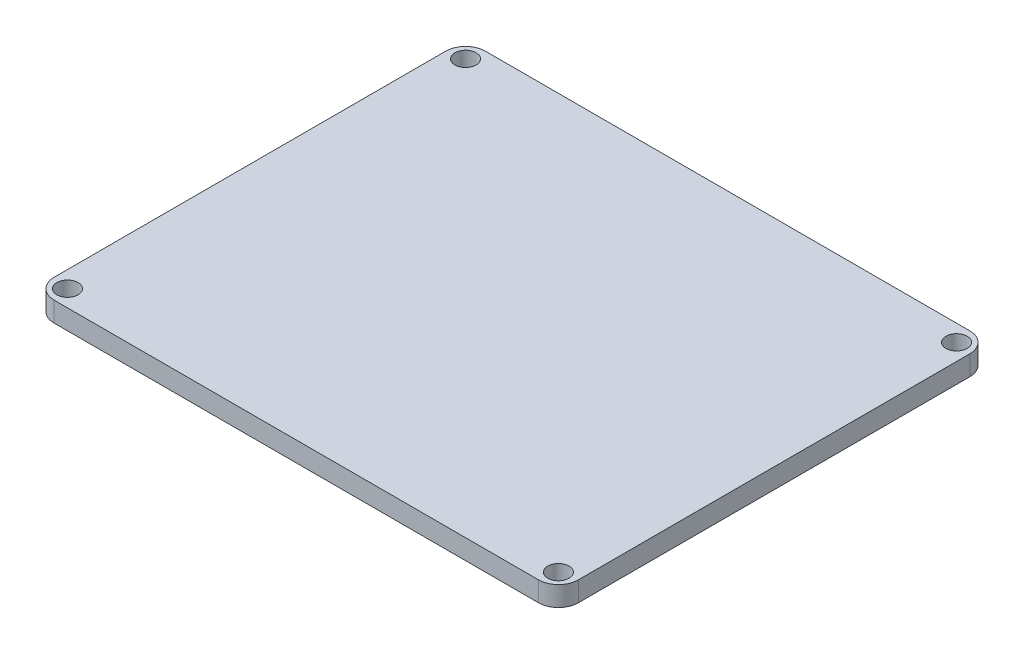
ISO-10303-21;
HEADER;
FILE_DESCRIPTION(('STEP AP214'),'2;1');
FILE_NAME('part.step','',(''),(''),'','','');
FILE_SCHEMA(('AUTOMOTIVE_DESIGN { 1 0 10303 214 1 1 1 1 }'));
ENDSEC;
DATA;
#1=APPLICATION_CONTEXT('core data for automotive mechanical design processes');
#2=APPLICATION_PROTOCOL_DEFINITION('international standard','automotive_design',2000,#1);
#3=PRODUCT_CONTEXT('',#1,'mechanical');
#4=PRODUCT('Part','Part','',(#3));
#5=PRODUCT_RELATED_PRODUCT_CATEGORY('part','',(#4));
#6=PRODUCT_DEFINITION_FORMATION('','',#4);
#7=PRODUCT_DEFINITION_CONTEXT('part definition',#1,'design');
#8=PRODUCT_DEFINITION('design','',#6,#7);
#9=PRODUCT_DEFINITION_SHAPE('','',#8);
#10=(LENGTH_UNIT() NAMED_UNIT(*) SI_UNIT(.MILLI.,.METRE.));
#11=(NAMED_UNIT(*) PLANE_ANGLE_UNIT() SI_UNIT($,.RADIAN.));
#12=(NAMED_UNIT(*) SI_UNIT($,.STERADIAN.) SOLID_ANGLE_UNIT());
#13=UNCERTAINTY_MEASURE_WITH_UNIT(LENGTH_MEASURE(1.E-05),#10,'distance_accuracy_value','');
#14=(GEOMETRIC_REPRESENTATION_CONTEXT(3) GLOBAL_UNCERTAINTY_ASSIGNED_CONTEXT((#13)) GLOBAL_UNIT_ASSIGNED_CONTEXT((#10,
#11,#12)) REPRESENTATION_CONTEXT('',''));
#15=CARTESIAN_POINT('',(0.,0.,0.));
#16=DIRECTION('',(0.,0.,1.));
#17=DIRECTION('',(1.,0.,0.));
#18=AXIS2_PLACEMENT_3D('',#15,#16,#17);
#19=CARTESIAN_POINT('',(0.,3.,0.));
#20=DIRECTION('',(0.,1.,0.));
#21=DIRECTION('',(0.,0.,1.));
#22=AXIS2_PLACEMENT_3D('',#19,#20,#21);
#23=PLANE('',#22);
#24=CARTESIAN_POINT('',(74.,3.,0.));
#25=DIRECTION('',(0.,1.,0.));
#26=DIRECTION('',(0.,0.,1.));
#27=AXIS2_PLACEMENT_3D('',#24,#25,#26);
#28=CIRCLE('',#27,1.60000000000001);
#29=CARTESIAN_POINT('',(74.,3.,1.60000000000001));
#30=VERTEX_POINT('',#29);
#31=EDGE_CURVE('E214',#30,#30,#28,.T.);
#32=ORIENTED_EDGE('',*,*,#31,.F.);
#33=EDGE_LOOP('',(#32));
#34=FACE_BOUND('',#33,.T.);
#35=CARTESIAN_POINT('',(0.,3.,-60.));
#36=DIRECTION('',(0.,1.,0.));
#37=DIRECTION('',(0.,0.,1.));
#38=AXIS2_PLACEMENT_3D('',#35,#36,#37);
#39=CIRCLE('',#38,1.6);
#40=CARTESIAN_POINT('',(0.,3.,-58.4));
#41=VERTEX_POINT('',#40);
#42=EDGE_CURVE('E190',#41,#41,#39,.T.);
#43=ORIENTED_EDGE('',*,*,#42,.F.);
#44=EDGE_LOOP('',(#43));
#45=FACE_BOUND('',#44,.T.);
#46=DIRECTION('',(0.,0.,-1.));
#47=VECTOR('',#46,1.);
#48=CARTESIAN_POINT('',(76.5,3.,2.50000000000001));
#49=LINE('',#48,#47);
#50=CARTESIAN_POINT('',(76.5,3.,-0.499999999999987));
#51=VERTEX_POINT('',#50);
#52=CARTESIAN_POINT('',(76.5,3.,-59.5));
#53=VERTEX_POINT('',#52);
#54=EDGE_CURVE('E200',#51,#53,#49,.T.);
#55=ORIENTED_EDGE('',*,*,#54,.T.);
#56=CARTESIAN_POINT('',(73.5,3.,-59.5));
#57=DIRECTION('',(0.,1.,0.));
#58=DIRECTION('',(0.,0.,1.));
#59=AXIS2_PLACEMENT_3D('',#56,#57,#58);
#60=CIRCLE('',#59,3.);
#61=CARTESIAN_POINT('',(73.5,3.,-62.5));
#62=VERTEX_POINT('',#61);
#63=EDGE_CURVE('E169',#53,#62,#60,.T.);
#64=ORIENTED_EDGE('',*,*,#63,.T.);
#65=DIRECTION('',(-1.,0.,0.));
#66=VECTOR('',#65,1.);
#67=CARTESIAN_POINT('',(76.5,3.,-62.5));
#68=LINE('',#67,#66);
#69=CARTESIAN_POINT('',(0.5,3.,-62.5));
#70=VERTEX_POINT('',#69);
#71=EDGE_CURVE('E127',#62,#70,#68,.T.);
#72=ORIENTED_EDGE('',*,*,#71,.T.);
#73=CARTESIAN_POINT('',(0.499999999999998,3.,-59.5));
#74=DIRECTION('',(0.,1.,0.));
#75=DIRECTION('',(0.,0.,1.));
#76=AXIS2_PLACEMENT_3D('',#73,#74,#75);
#77=CIRCLE('',#76,3.);
#78=CARTESIAN_POINT('',(-2.5,3.,-59.5));
#79=VERTEX_POINT('',#78);
#80=EDGE_CURVE('E161',#70,#79,#77,.T.);
#81=ORIENTED_EDGE('',*,*,#80,.T.);
#82=DIRECTION('',(0.,0.,1.));
#83=VECTOR('',#82,1.);
#84=CARTESIAN_POINT('',(-2.5,3.,2.50000000000002));
#85=LINE('',#84,#83);
#86=CARTESIAN_POINT('',(-2.5,3.,-0.499999999999978));
#87=VERTEX_POINT('',#86);
#88=EDGE_CURVE('E136',#79,#87,#85,.T.);
#89=ORIENTED_EDGE('',*,*,#88,.T.);
#90=CARTESIAN_POINT('',(0.5,3.,-0.499999999999978));
#91=DIRECTION('',(0.,1.,0.));
#92=DIRECTION('',(0.,0.,1.));
#93=AXIS2_PLACEMENT_3D('',#90,#91,#92);
#94=CIRCLE('',#93,3.);
#95=CARTESIAN_POINT('',(0.5,3.,2.50000000000002));
#96=VERTEX_POINT('',#95);
#97=EDGE_CURVE('E62',#87,#96,#94,.T.);
#98=ORIENTED_EDGE('',*,*,#97,.T.);
#99=DIRECTION('',(1.,0.,0.));
#100=VECTOR('',#99,1.);
#101=CARTESIAN_POINT('',(76.5,3.,2.50000000000001));
#102=LINE('',#101,#100);
#103=CARTESIAN_POINT('',(73.5,3.,2.50000000000001));
#104=VERTEX_POINT('',#103);
#105=EDGE_CURVE('E141',#96,#104,#102,.T.);
#106=ORIENTED_EDGE('',*,*,#105,.T.);
#107=CARTESIAN_POINT('',(73.5,3.,-0.499999999999987));
#108=DIRECTION('',(0.,1.,0.));
#109=DIRECTION('',(0.,0.,1.));
#110=AXIS2_PLACEMENT_3D('',#107,#108,#109);
#111=CIRCLE('',#110,3.);
#112=EDGE_CURVE('E166',#104,#51,#111,.T.);
#113=ORIENTED_EDGE('',*,*,#112,.T.);
#114=EDGE_LOOP('',(#55,#64,#72,#81,#89,#98,#106,#113));
#115=FACE_BOUND('',#114,.T.);
#116=CARTESIAN_POINT('',(74.,3.,-60.));
#117=DIRECTION('',(0.,1.,0.));
#118=DIRECTION('',(0.,0.,1.));
#119=AXIS2_PLACEMENT_3D('',#116,#117,#118);
#120=CIRCLE('',#119,1.60000000000001);
#121=CARTESIAN_POINT('',(74.,3.,-58.4));
#122=VERTEX_POINT('',#121);
#123=EDGE_CURVE('E208',#122,#122,#120,.T.);
#124=ORIENTED_EDGE('',*,*,#123,.F.);
#125=EDGE_LOOP('',(#124));
#126=FACE_BOUND('',#125,.T.);
#127=CARTESIAN_POINT('',(0.,3.,0.));
#128=DIRECTION('',(0.,1.,0.));
#129=DIRECTION('',(0.,0.,1.));
#130=AXIS2_PLACEMENT_3D('',#127,#128,#129);
#131=CIRCLE('',#130,1.6);
#132=CARTESIAN_POINT('',(0.,3.,1.6));
#133=VERTEX_POINT('',#132);
#134=EDGE_CURVE('E222',#133,#133,#131,.T.);
#135=ORIENTED_EDGE('',*,*,#134,.F.);
#136=EDGE_LOOP('',(#135));
#137=FACE_BOUND('',#136,.T.);
#138=ADVANCED_FACE('F39',(#34,#45,#115,#126,#137),#23,.T.);
#139=CARTESIAN_POINT('',(0.,0.,0.));
#140=DIRECTION('',(0.,1.,0.));
#141=DIRECTION('',(0.,0.,1.));
#142=AXIS2_PLACEMENT_3D('',#139,#140,#141);
#143=PLANE('',#142);
#144=DIRECTION('',(-1.,0.,0.));
#145=VECTOR('',#144,1.);
#146=CARTESIAN_POINT('',(76.5,0.,-62.5));
#147=LINE('',#146,#145);
#148=CARTESIAN_POINT('',(73.5,0.,-62.5));
#149=VERTEX_POINT('',#148);
#150=CARTESIAN_POINT('',(0.5,0.,-62.5));
#151=VERTEX_POINT('',#150);
#152=EDGE_CURVE('E124',#149,#151,#147,.T.);
#153=ORIENTED_EDGE('',*,*,#152,.F.);
#154=CARTESIAN_POINT('',(73.5,0.,-59.5));
#155=DIRECTION('',(0.,1.,0.));
#156=DIRECTION('',(0.,0.,1.));
#157=AXIS2_PLACEMENT_3D('',#154,#155,#156);
#158=CIRCLE('',#157,3.);
#159=CARTESIAN_POINT('',(76.5,0.,-59.5));
#160=VERTEX_POINT('',#159);
#161=EDGE_CURVE('E106',#149,#160,#158,.F.);
#162=ORIENTED_EDGE('',*,*,#161,.T.);
#163=DIRECTION('',(0.,0.,-1.));
#164=VECTOR('',#163,1.);
#165=CARTESIAN_POINT('',(76.5,0.,2.50000000000001));
#166=LINE('',#165,#164);
#167=CARTESIAN_POINT('',(76.5,0.,-0.499999999999987));
#168=VERTEX_POINT('',#167);
#169=EDGE_CURVE('E137',#168,#160,#166,.T.);
#170=ORIENTED_EDGE('',*,*,#169,.F.);
#171=CARTESIAN_POINT('',(73.5,0.,-0.499999999999987));
#172=DIRECTION('',(0.,1.,0.));
#173=DIRECTION('',(0.,0.,1.));
#174=AXIS2_PLACEMENT_3D('',#171,#172,#173);
#175=CIRCLE('',#174,3.);
#176=CARTESIAN_POINT('',(73.5,0.,2.50000000000001));
#177=VERTEX_POINT('',#176);
#178=EDGE_CURVE('E118',#168,#177,#175,.F.);
#179=ORIENTED_EDGE('',*,*,#178,.T.);
#180=DIRECTION('',(1.,0.,0.));
#181=VECTOR('',#180,1.);
#182=CARTESIAN_POINT('',(76.5,0.,2.50000000000001));
#183=LINE('',#182,#181);
#184=CARTESIAN_POINT('',(0.5,0.,2.50000000000002));
#185=VERTEX_POINT('',#184);
#186=EDGE_CURVE('E143',#185,#177,#183,.T.);
#187=ORIENTED_EDGE('',*,*,#186,.F.);
#188=CARTESIAN_POINT('',(0.5,0.,-0.499999999999978));
#189=DIRECTION('',(0.,1.,0.));
#190=DIRECTION('',(0.,0.,1.));
#191=AXIS2_PLACEMENT_3D('',#188,#189,#190);
#192=CIRCLE('',#191,3.);
#193=CARTESIAN_POINT('',(-2.5,0.,-0.499999999999978));
#194=VERTEX_POINT('',#193);
#195=EDGE_CURVE('E151',#185,#194,#192,.F.);
#196=ORIENTED_EDGE('',*,*,#195,.T.);
#197=DIRECTION('',(0.,0.,1.));
#198=VECTOR('',#197,1.);
#199=CARTESIAN_POINT('',(-2.5,0.,2.50000000000002));
#200=LINE('',#199,#198);
#201=CARTESIAN_POINT('',(-2.5,0.,-59.5));
#202=VERTEX_POINT('',#201);
#203=EDGE_CURVE('E184',#202,#194,#200,.T.);
#204=ORIENTED_EDGE('',*,*,#203,.F.);
#205=CARTESIAN_POINT('',(0.499999999999998,0.,-59.5));
#206=DIRECTION('',(0.,1.,0.));
#207=DIRECTION('',(0.,0.,1.));
#208=AXIS2_PLACEMENT_3D('',#205,#206,#207);
#209=CIRCLE('',#208,3.);
#210=EDGE_CURVE('E129',#202,#151,#209,.F.);
#211=ORIENTED_EDGE('',*,*,#210,.T.);
#212=EDGE_LOOP('',(#153,#162,#170,#179,#187,#196,#204,#211));
#213=FACE_BOUND('',#212,.T.);
#214=CARTESIAN_POINT('',(0.,0.,-60.));
#215=DIRECTION('',(0.,1.,0.));
#216=DIRECTION('',(0.,0.,1.));
#217=AXIS2_PLACEMENT_3D('',#214,#215,#216);
#218=CIRCLE('',#217,1.6);
#219=CARTESIAN_POINT('',(0.,0.,-58.4));
#220=VERTEX_POINT('',#219);
#221=EDGE_CURVE('E195',#220,#220,#218,.T.);
#222=ORIENTED_EDGE('',*,*,#221,.T.);
#223=EDGE_LOOP('',(#222));
#224=FACE_BOUND('',#223,.T.);
#225=CARTESIAN_POINT('',(74.,0.,-60.));
#226=DIRECTION('',(0.,1.,0.));
#227=DIRECTION('',(0.,0.,1.));
#228=AXIS2_PLACEMENT_3D('',#225,#226,#227);
#229=CIRCLE('',#228,1.60000000000001);
#230=CARTESIAN_POINT('',(74.,0.,-58.4));
#231=VERTEX_POINT('',#230);
#232=EDGE_CURVE('E210',#231,#231,#229,.T.);
#233=ORIENTED_EDGE('',*,*,#232,.T.);
#234=EDGE_LOOP('',(#233));
#235=FACE_BOUND('',#234,.T.);
#236=CARTESIAN_POINT('',(74.,0.,0.));
#237=DIRECTION('',(0.,1.,0.));
#238=DIRECTION('',(0.,0.,1.));
#239=AXIS2_PLACEMENT_3D('',#236,#237,#238);
#240=CIRCLE('',#239,1.60000000000001);
#241=CARTESIAN_POINT('',(74.,0.,1.60000000000001));
#242=VERTEX_POINT('',#241);
#243=EDGE_CURVE('E218',#242,#242,#240,.T.);
#244=ORIENTED_EDGE('',*,*,#243,.T.);
#245=EDGE_LOOP('',(#244));
#246=FACE_BOUND('',#245,.T.);
#247=CARTESIAN_POINT('',(0.,0.,0.));
#248=DIRECTION('',(0.,1.,0.));
#249=DIRECTION('',(0.,0.,1.));
#250=AXIS2_PLACEMENT_3D('',#247,#248,#249);
#251=CIRCLE('',#250,1.6);
#252=CARTESIAN_POINT('',(0.,0.,1.6));
#253=VERTEX_POINT('',#252);
#254=EDGE_CURVE('E226',#253,#253,#251,.T.);
#255=ORIENTED_EDGE('',*,*,#254,.T.);
#256=EDGE_LOOP('',(#255));
#257=FACE_BOUND('',#256,.T.);
#258=ADVANCED_FACE('F132',(#213,#224,#235,#246,#257),#143,.F.);
#259=CARTESIAN_POINT('',(-2.5,3.,2.50000000000002));
#260=DIRECTION('',(1.,0.,0.));
#261=DIRECTION('',(0.,0.,-1.));
#262=AXIS2_PLACEMENT_3D('',#259,#260,#261);
#263=PLANE('',#262);
#264=ORIENTED_EDGE('',*,*,#203,.T.);
#265=DIRECTION('',(0.,-1.,0.));
#266=VECTOR('',#265,1.);
#267=CARTESIAN_POINT('',(-2.5,3.,-0.499999999999978));
#268=LINE('',#267,#266);
#269=EDGE_CURVE('E11',#194,#87,#268,.F.);
#270=ORIENTED_EDGE('',*,*,#269,.T.);
#271=ORIENTED_EDGE('',*,*,#88,.F.);
#272=DIRECTION('',(0.,-1.,0.));
#273=VECTOR('',#272,1.);
#274=CARTESIAN_POINT('',(-2.5,3.,-59.5));
#275=LINE('',#274,#273);
#276=EDGE_CURVE('E48',#79,#202,#275,.T.);
#277=ORIENTED_EDGE('',*,*,#276,.T.);
#278=EDGE_LOOP('',(#264,#270,#271,#277));
#279=FACE_BOUND('',#278,.T.);
#280=ADVANCED_FACE('F183',(#279),#263,.F.);
#281=CARTESIAN_POINT('',(76.5,3.,2.50000000000001));
#282=DIRECTION('',(0.,0.,-1.));
#283=DIRECTION('',(-1.,0.,0.));
#284=AXIS2_PLACEMENT_3D('',#281,#282,#283);
#285=PLANE('',#284);
#286=ORIENTED_EDGE('',*,*,#186,.T.);
#287=DIRECTION('',(0.,-1.,0.));
#288=VECTOR('',#287,1.);
#289=CARTESIAN_POINT('',(73.5,3.,2.50000000000001));
#290=LINE('',#289,#288);
#291=EDGE_CURVE('E55',#177,#104,#290,.F.);
#292=ORIENTED_EDGE('',*,*,#291,.T.);
#293=ORIENTED_EDGE('',*,*,#105,.F.);
#294=DIRECTION('',(0.,-1.,0.));
#295=VECTOR('',#294,1.);
#296=CARTESIAN_POINT('',(0.5,3.,2.50000000000002));
#297=LINE('',#296,#295);
#298=EDGE_CURVE('E172',#96,#185,#297,.T.);
#299=ORIENTED_EDGE('',*,*,#298,.T.);
#300=EDGE_LOOP('',(#286,#292,#293,#299));
#301=FACE_BOUND('',#300,.T.);
#302=ADVANCED_FACE('F255',(#301),#285,.F.);
#303=CARTESIAN_POINT('',(76.5,3.,2.50000000000001));
#304=DIRECTION('',(-1.,0.,0.));
#305=DIRECTION('',(0.,0.,1.));
#306=AXIS2_PLACEMENT_3D('',#303,#304,#305);
#307=PLANE('',#306);
#308=ORIENTED_EDGE('',*,*,#169,.T.);
#309=DIRECTION('',(0.,-1.,0.));
#310=VECTOR('',#309,1.);
#311=CARTESIAN_POINT('',(76.5,3.,-59.5));
#312=LINE('',#311,#310);
#313=EDGE_CURVE('E111',#160,#53,#312,.F.);
#314=ORIENTED_EDGE('',*,*,#313,.T.);
#315=ORIENTED_EDGE('',*,*,#54,.F.);
#316=DIRECTION('',(0.,-1.,0.));
#317=VECTOR('',#316,1.);
#318=CARTESIAN_POINT('',(76.5,3.,-0.499999999999987));
#319=LINE('',#318,#317);
#320=EDGE_CURVE('E117',#51,#168,#319,.T.);
#321=ORIENTED_EDGE('',*,*,#320,.T.);
#322=EDGE_LOOP('',(#308,#314,#315,#321));
#323=FACE_BOUND('',#322,.T.);
#324=ADVANCED_FACE('F252',(#323),#307,.F.);
#325=CARTESIAN_POINT('',(76.5,3.,-62.5));
#326=DIRECTION('',(0.,0.,1.));
#327=DIRECTION('',(1.,0.,0.));
#328=AXIS2_PLACEMENT_3D('',#325,#326,#327);
#329=PLANE('',#328);
#330=ORIENTED_EDGE('',*,*,#71,.F.);
#331=DIRECTION('',(0.,-1.,0.));
#332=VECTOR('',#331,1.);
#333=CARTESIAN_POINT('',(73.5,3.,-62.5));
#334=LINE('',#333,#332);
#335=EDGE_CURVE('E110',#62,#149,#334,.T.);
#336=ORIENTED_EDGE('',*,*,#335,.T.);
#337=ORIENTED_EDGE('',*,*,#152,.T.);
#338=DIRECTION('',(0.,-1.,0.));
#339=VECTOR('',#338,1.);
#340=CARTESIAN_POINT('',(0.5,3.,-62.5));
#341=LINE('',#340,#339);
#342=EDGE_CURVE('E130',#151,#70,#341,.F.);
#343=ORIENTED_EDGE('',*,*,#342,.T.);
#344=EDGE_LOOP('',(#330,#336,#337,#343));
#345=FACE_BOUND('',#344,.T.);
#346=ADVANCED_FACE('F123',(#345),#329,.F.);
#347=CARTESIAN_POINT('',(0.,3.,-60.));
#348=DIRECTION('',(0.,-1.,0.));
#349=DIRECTION('',(0.,0.,-1.));
#350=AXIS2_PLACEMENT_3D('',#347,#348,#349);
#351=CYLINDRICAL_SURFACE('',#350,1.6);
#352=ORIENTED_EDGE('',*,*,#42,.T.);
#353=EDGE_LOOP('',(#352));
#354=FACE_BOUND('',#353,.T.);
#355=ORIENTED_EDGE('',*,*,#221,.F.);
#356=EDGE_LOOP('',(#355));
#357=FACE_BOUND('',#356,.T.);
#358=ADVANCED_FACE('F247',(#354,#357),#351,.F.);
#359=CARTESIAN_POINT('',(74.,3.,-60.));
#360=DIRECTION('',(0.,-1.,0.));
#361=DIRECTION('',(0.,0.,-1.));
#362=AXIS2_PLACEMENT_3D('',#359,#360,#361);
#363=CYLINDRICAL_SURFACE('',#362,1.60000000000001);
#364=ORIENTED_EDGE('',*,*,#123,.T.);
#365=EDGE_LOOP('',(#364));
#366=FACE_BOUND('',#365,.T.);
#367=ORIENTED_EDGE('',*,*,#232,.F.);
#368=EDGE_LOOP('',(#367));
#369=FACE_BOUND('',#368,.T.);
#370=ADVANCED_FACE('F279',(#366,#369),#363,.F.);
#371=CARTESIAN_POINT('',(74.,3.,0.));
#372=DIRECTION('',(0.,-1.,0.));
#373=DIRECTION('',(0.,0.,-1.));
#374=AXIS2_PLACEMENT_3D('',#371,#372,#373);
#375=CYLINDRICAL_SURFACE('',#374,1.60000000000001);
#376=ORIENTED_EDGE('',*,*,#31,.T.);
#377=EDGE_LOOP('',(#376));
#378=FACE_BOUND('',#377,.T.);
#379=ORIENTED_EDGE('',*,*,#243,.F.);
#380=EDGE_LOOP('',(#379));
#381=FACE_BOUND('',#380,.T.);
#382=ADVANCED_FACE('F282',(#378,#381),#375,.F.);
#383=CARTESIAN_POINT('',(0.,3.,0.));
#384=DIRECTION('',(0.,-1.,0.));
#385=DIRECTION('',(0.,0.,-1.));
#386=AXIS2_PLACEMENT_3D('',#383,#384,#385);
#387=CYLINDRICAL_SURFACE('',#386,1.6);
#388=ORIENTED_EDGE('',*,*,#134,.T.);
#389=EDGE_LOOP('',(#388));
#390=FACE_BOUND('',#389,.T.);
#391=ORIENTED_EDGE('',*,*,#254,.F.);
#392=EDGE_LOOP('',(#391));
#393=FACE_BOUND('',#392,.T.);
#394=ADVANCED_FACE('F234',(#390,#393),#387,.F.);
#395=CARTESIAN_POINT('',(73.5,3.,-59.5));
#396=DIRECTION('',(0.,-1.,0.));
#397=DIRECTION('',(0.,0.,-1.));
#398=AXIS2_PLACEMENT_3D('',#395,#396,#397);
#399=CYLINDRICAL_SURFACE('',#398,3.);
#400=ORIENTED_EDGE('',*,*,#63,.F.);
#401=ORIENTED_EDGE('',*,*,#313,.F.);
#402=ORIENTED_EDGE('',*,*,#161,.F.);
#403=ORIENTED_EDGE('',*,*,#335,.F.);
#404=EDGE_LOOP('',(#400,#401,#402,#403));
#405=FACE_BOUND('',#404,.T.);
#406=ADVANCED_FACE('F109',(#405),#399,.T.);
#407=CARTESIAN_POINT('',(73.5,3.,-0.499999999999987));
#408=DIRECTION('',(0.,-1.,0.));
#409=DIRECTION('',(0.,0.,-1.));
#410=AXIS2_PLACEMENT_3D('',#407,#408,#409);
#411=CYLINDRICAL_SURFACE('',#410,3.);
#412=ORIENTED_EDGE('',*,*,#112,.F.);
#413=ORIENTED_EDGE('',*,*,#291,.F.);
#414=ORIENTED_EDGE('',*,*,#178,.F.);
#415=ORIENTED_EDGE('',*,*,#320,.F.);
#416=EDGE_LOOP('',(#412,#413,#414,#415));
#417=FACE_BOUND('',#416,.T.);
#418=ADVANCED_FACE('F263',(#417),#411,.T.);
#419=CARTESIAN_POINT('',(0.5,3.,-0.499999999999978));
#420=DIRECTION('',(0.,-1.,0.));
#421=DIRECTION('',(0.,0.,-1.));
#422=AXIS2_PLACEMENT_3D('',#419,#420,#421);
#423=CYLINDRICAL_SURFACE('',#422,3.);
#424=ORIENTED_EDGE('',*,*,#97,.F.);
#425=ORIENTED_EDGE('',*,*,#269,.F.);
#426=ORIENTED_EDGE('',*,*,#195,.F.);
#427=ORIENTED_EDGE('',*,*,#298,.F.);
#428=EDGE_LOOP('',(#424,#425,#426,#427));
#429=FACE_BOUND('',#428,.T.);
#430=ADVANCED_FACE('F265',(#429),#423,.T.);
#431=CARTESIAN_POINT('',(0.499999999999998,3.,-59.5));
#432=DIRECTION('',(0.,-1.,0.));
#433=DIRECTION('',(0.,0.,-1.));
#434=AXIS2_PLACEMENT_3D('',#431,#432,#433);
#435=CYLINDRICAL_SURFACE('',#434,3.);
#436=ORIENTED_EDGE('',*,*,#80,.F.);
#437=ORIENTED_EDGE('',*,*,#342,.F.);
#438=ORIENTED_EDGE('',*,*,#210,.F.);
#439=ORIENTED_EDGE('',*,*,#276,.F.);
#440=EDGE_LOOP('',(#436,#437,#438,#439));
#441=FACE_BOUND('',#440,.T.);
#442=ADVANCED_FACE('F41',(#441),#435,.T.);
#443=CLOSED_SHELL('',(#138,#258,#280,#302,#324,#346,#358,#370,#382,#394,#406,#418,#430,#442));
#444=MANIFOLD_SOLID_BREP('B2',#443);
#445=ADVANCED_BREP_SHAPE_REPRESENTATION('',(#18,#444),#14);
#446=SHAPE_DEFINITION_REPRESENTATION(#9,#445);
ENDSEC;
END-ISO-10303-21;
